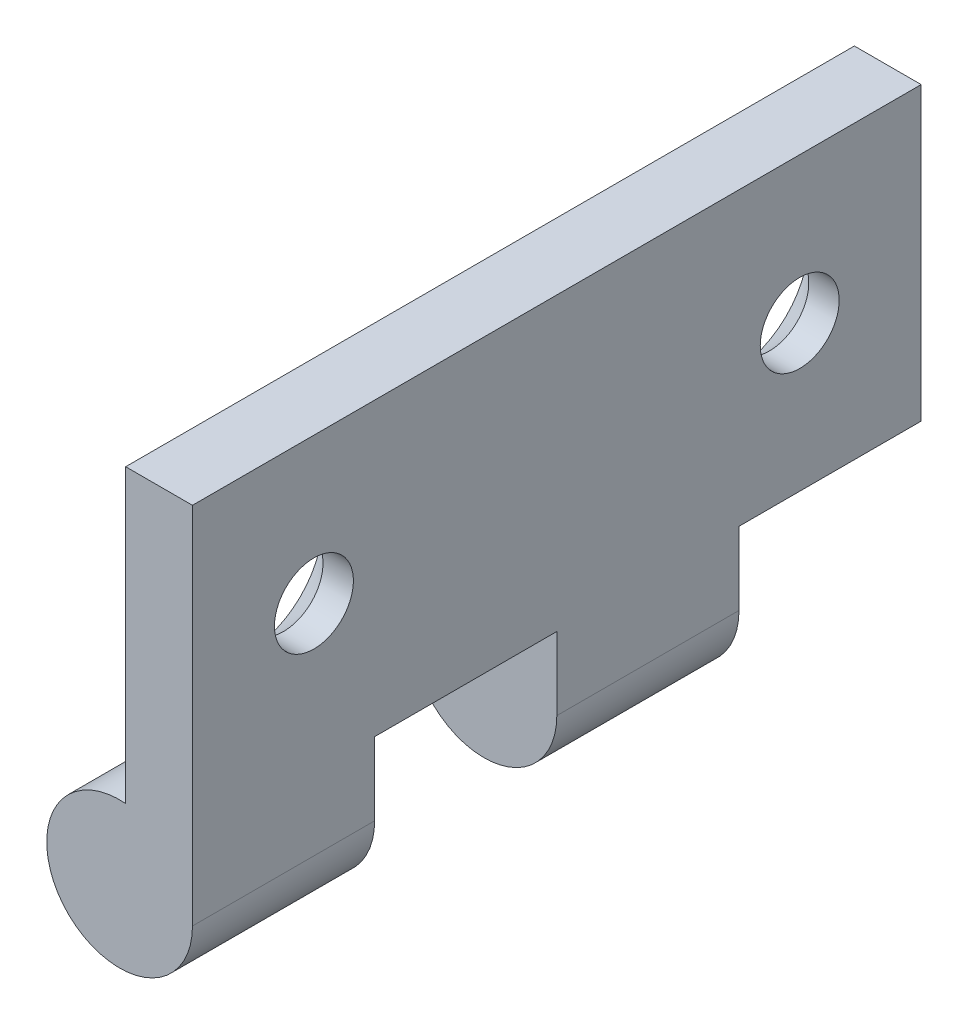
ISO-10303-21;
HEADER;
FILE_DESCRIPTION(('STEP AP214'),'2;1');
FILE_NAME('part.step','',(''),(''),'','','');
FILE_SCHEMA(('AUTOMOTIVE_DESIGN { 1 0 10303 214 1 1 1 1 }'));
ENDSEC;
DATA;
#1=APPLICATION_CONTEXT('core data for automotive mechanical design processes');
#2=APPLICATION_PROTOCOL_DEFINITION('international standard','automotive_design',2000,#1);
#3=PRODUCT_CONTEXT('',#1,'mechanical');
#4=PRODUCT('Part','Part','',(#3));
#5=PRODUCT_RELATED_PRODUCT_CATEGORY('part','',(#4));
#6=PRODUCT_DEFINITION_FORMATION('','',#4);
#7=PRODUCT_DEFINITION_CONTEXT('part definition',#1,'design');
#8=PRODUCT_DEFINITION('design','',#6,#7);
#9=PRODUCT_DEFINITION_SHAPE('','',#8);
#10=(LENGTH_UNIT() NAMED_UNIT(*) SI_UNIT(.MILLI.,.METRE.));
#11=(NAMED_UNIT(*) PLANE_ANGLE_UNIT() SI_UNIT($,.RADIAN.));
#12=(NAMED_UNIT(*) SI_UNIT($,.STERADIAN.) SOLID_ANGLE_UNIT());
#13=UNCERTAINTY_MEASURE_WITH_UNIT(LENGTH_MEASURE(1.E-05),#10,'distance_accuracy_value','');
#14=(GEOMETRIC_REPRESENTATION_CONTEXT(3) GLOBAL_UNCERTAINTY_ASSIGNED_CONTEXT((#13)) GLOBAL_UNIT_ASSIGNED_CONTEXT((#10,
#11,#12)) REPRESENTATION_CONTEXT('',''));
#15=CARTESIAN_POINT('',(0.,0.,0.));
#16=DIRECTION('',(0.,0.,1.));
#17=DIRECTION('',(1.,0.,0.));
#18=AXIS2_PLACEMENT_3D('',#15,#16,#17);
#19=CARTESIAN_POINT('',(-405.506284026579,449.849816187996,266.899348249654));
#20=DIRECTION('',(0.,0.,1.));
#21=DIRECTION('',(0.,-1.,0.));
#22=AXIS2_PLACEMENT_3D('',#19,#20,#21);
#23=CYLINDRICAL_SURFACE('',#22,6.);
#24=CARTESIAN_POINT('',(-405.506284026579,449.849816187996,311.899348249654));
#25=DIRECTION('',(0.,0.,-1.));
#26=DIRECTION('',(0.,-1.,0.));
#27=AXIS2_PLACEMENT_3D('',#24,#25,#26);
#28=CIRCLE('',#27,6.);
#29=CARTESIAN_POINT('',(-405.006284026579,455.828946559547,311.899348249654));
#30=VERTEX_POINT('',#29);
#31=CARTESIAN_POINT('',(-399.506284026579,449.849816187996,311.899348249654));
#32=VERTEX_POINT('',#31);
#33=EDGE_CURVE('E125',#30,#32,#28,.F.);
#34=ORIENTED_EDGE('',*,*,#33,.T.);
#35=DIRECTION('',(0.,0.,1.));
#36=VECTOR('',#35,1.);
#37=CARTESIAN_POINT('',(-399.506284026579,449.849816187996,266.899348249654));
#38=LINE('',#37,#36);
#39=CARTESIAN_POINT('',(-399.506284026579,449.849816187996,326.899348249654));
#40=VERTEX_POINT('',#39);
#41=EDGE_CURVE('E167',#32,#40,#38,.T.);
#42=ORIENTED_EDGE('',*,*,#41,.T.);
#43=CARTESIAN_POINT('',(-405.506284026579,449.849816187996,326.899348249654));
#44=DIRECTION('',(0.,0.,-1.));
#45=DIRECTION('',(0.,-1.,0.));
#46=AXIS2_PLACEMENT_3D('',#43,#44,#45);
#47=CIRCLE('',#46,6.);
#48=CARTESIAN_POINT('',(-405.006284026579,455.828946559547,326.899348249654));
#49=VERTEX_POINT('',#48);
#50=EDGE_CURVE('E155',#40,#49,#47,.T.);
#51=ORIENTED_EDGE('',*,*,#50,.T.);
#52=DIRECTION('',(0.,0.,1.));
#53=VECTOR('',#52,1.);
#54=CARTESIAN_POINT('',(-405.006284026579,455.828946559547,266.899348249654));
#55=LINE('',#54,#53);
#56=EDGE_CURVE('E164',#30,#49,#55,.T.);
#57=ORIENTED_EDGE('',*,*,#56,.F.);
#58=EDGE_LOOP('',(#34,#42,#51,#57));
#59=FACE_BOUND('',#58,.T.);
#60=ADVANCED_FACE('F15',(#59),#23,.T.);
#61=CARTESIAN_POINT('',(-399.506284026579,479.849816187997,266.899348249654));
#62=DIRECTION('',(0.,1.,0.));
#63=DIRECTION('',(0.,0.,1.));
#64=AXIS2_PLACEMENT_3D('',#61,#62,#63);
#65=PLANE('',#64);
#66=DIRECTION('',(1.,0.,0.));
#67=VECTOR('',#66,1.);
#68=CARTESIAN_POINT('',(-399.506284026579,479.849816187997,326.899348249654));
#69=LINE('',#68,#67);
#70=CARTESIAN_POINT('',(-405.006284026579,479.849816187997,326.899348249654));
#71=VERTEX_POINT('',#70);
#72=CARTESIAN_POINT('',(-399.506284026579,479.849816187997,326.899348249654));
#73=VERTEX_POINT('',#72);
#74=EDGE_CURVE('E141',#71,#73,#69,.T.);
#75=ORIENTED_EDGE('',*,*,#74,.T.);
#76=DIRECTION('',(0.,0.,1.));
#77=VECTOR('',#76,1.);
#78=CARTESIAN_POINT('',(-399.506284026579,479.849816187997,266.899348249654));
#79=LINE('',#78,#77);
#80=CARTESIAN_POINT('',(-399.506284026579,479.849816187997,266.899348249654));
#81=VERTEX_POINT('',#80);
#82=EDGE_CURVE('E150',#81,#73,#79,.T.);
#83=ORIENTED_EDGE('',*,*,#82,.F.);
#84=DIRECTION('',(1.,0.,0.));
#85=VECTOR('',#84,1.);
#86=CARTESIAN_POINT('',(-399.506284026579,479.849816187997,266.899348249654));
#87=LINE('',#86,#85);
#88=CARTESIAN_POINT('',(-405.006284026579,479.849816187997,266.899348249654));
#89=VERTEX_POINT('',#88);
#90=EDGE_CURVE('E142',#89,#81,#87,.T.);
#91=ORIENTED_EDGE('',*,*,#90,.F.);
#92=DIRECTION('',(0.,0.,1.));
#93=VECTOR('',#92,1.);
#94=CARTESIAN_POINT('',(-405.006284026579,479.849816187997,266.899348249654));
#95=LINE('',#94,#93);
#96=EDGE_CURVE('E159',#89,#71,#95,.T.);
#97=ORIENTED_EDGE('',*,*,#96,.T.);
#98=EDGE_LOOP('',(#75,#83,#91,#97));
#99=FACE_BOUND('',#98,.T.);
#100=ADVANCED_FACE('F193',(#99),#65,.T.);
#101=CARTESIAN_POINT('',(-405.006284026579,479.849816187997,266.899348249654));
#102=DIRECTION('',(-1.,0.,0.));
#103=DIRECTION('',(0.,0.,1.));
#104=AXIS2_PLACEMENT_3D('',#101,#102,#103);
#105=PLANE('',#104);
#106=CARTESIAN_POINT('',(-405.006284026579,467.849816187996,316.899348249654));
#107=DIRECTION('',(1.,0.,0.));
#108=DIRECTION('',(0.,0.,1.));
#109=AXIS2_PLACEMENT_3D('',#106,#107,#108);
#110=CIRCLE('',#109,6.25000000000003);
#111=CARTESIAN_POINT('',(-405.006284026579,467.849816187996,323.149348249654));
#112=VERTEX_POINT('',#111);
#113=EDGE_CURVE('E23',#112,#112,#110,.F.);
#114=ORIENTED_EDGE('',*,*,#113,.F.);
#115=EDGE_LOOP('',(#114));
#116=FACE_BOUND('',#115,.T.);
#117=CARTESIAN_POINT('',(-405.006284026579,467.849816187996,276.899348249654));
#118=DIRECTION('',(1.,0.,0.));
#119=DIRECTION('',(0.,0.,1.));
#120=AXIS2_PLACEMENT_3D('',#117,#118,#119);
#121=CIRCLE('',#120,6.25000000000003);
#122=CARTESIAN_POINT('',(-405.006284026579,467.849816187996,283.149348249654));
#123=VERTEX_POINT('',#122);
#124=EDGE_CURVE('E181',#123,#123,#121,.F.);
#125=ORIENTED_EDGE('',*,*,#124,.F.);
#126=EDGE_LOOP('',(#125));
#127=FACE_BOUND('',#126,.T.);
#128=DIRECTION('',(0.,0.,1.));
#129=VECTOR('',#128,1.);
#130=CARTESIAN_POINT('',(-405.006284026579,455.849816187996,266.899348249654));
#131=LINE('',#130,#129);
#132=CARTESIAN_POINT('',(-405.006284026579,455.849816187996,266.899348249654));
#133=VERTEX_POINT('',#132);
#134=CARTESIAN_POINT('',(-405.006284026579,455.849816187996,281.899348249654));
#135=VERTEX_POINT('',#134);
#136=EDGE_CURVE('E116',#133,#135,#131,.T.);
#137=ORIENTED_EDGE('',*,*,#136,.T.);
#138=DIRECTION('',(0.,-1.,0.));
#139=VECTOR('',#138,1.);
#140=CARTESIAN_POINT('',(-405.006284026579,479.849816187997,281.899348249654));
#141=LINE('',#140,#139);
#142=CARTESIAN_POINT('',(-405.006284026579,455.828946559547,281.899348249654));
#143=VERTEX_POINT('',#142);
#144=EDGE_CURVE('E99',#135,#143,#141,.T.);
#145=ORIENTED_EDGE('',*,*,#144,.T.);
#146=CARTESIAN_POINT('',(-405.006284026579,455.828946559547,296.899348249654));
#147=VERTEX_POINT('',#146);
#148=EDGE_CURVE('E163',#143,#147,#55,.T.);
#149=ORIENTED_EDGE('',*,*,#148,.T.);
#150=DIRECTION('',(0.,1.,0.));
#151=VECTOR('',#150,1.);
#152=CARTESIAN_POINT('',(-405.006284026579,479.849816187997,296.899348249654));
#153=LINE('',#152,#151);
#154=CARTESIAN_POINT('',(-405.006284026579,455.849816187996,296.899348249654));
#155=VERTEX_POINT('',#154);
#156=EDGE_CURVE('E132',#147,#155,#153,.T.);
#157=ORIENTED_EDGE('',*,*,#156,.T.);
#158=DIRECTION('',(0.,0.,1.));
#159=VECTOR('',#158,1.);
#160=CARTESIAN_POINT('',(-405.006284026579,455.849816187996,266.899348249654));
#161=LINE('',#160,#159);
#162=CARTESIAN_POINT('',(-405.006284026579,455.849816187996,311.899348249654));
#163=VERTEX_POINT('',#162);
#164=EDGE_CURVE('E135',#155,#163,#161,.T.);
#165=ORIENTED_EDGE('',*,*,#164,.T.);
#166=DIRECTION('',(0.,-1.,0.));
#167=VECTOR('',#166,1.);
#168=CARTESIAN_POINT('',(-405.006284026579,479.849816187997,311.899348249654));
#169=LINE('',#168,#167);
#170=EDGE_CURVE('E128',#163,#30,#169,.T.);
#171=ORIENTED_EDGE('',*,*,#170,.T.);
#172=ORIENTED_EDGE('',*,*,#56,.T.);
#173=DIRECTION('',(0.,1.,0.));
#174=VECTOR('',#173,1.);
#175=CARTESIAN_POINT('',(-405.006284026579,479.849816187997,326.899348249654));
#176=LINE('',#175,#174);
#177=EDGE_CURVE('E146',#49,#71,#176,.T.);
#178=ORIENTED_EDGE('',*,*,#177,.T.);
#179=ORIENTED_EDGE('',*,*,#96,.F.);
#180=DIRECTION('',(0.,1.,0.));
#181=VECTOR('',#180,1.);
#182=CARTESIAN_POINT('',(-405.006284026579,479.849816187997,266.899348249654));
#183=LINE('',#182,#181);
#184=EDGE_CURVE('E148',#133,#89,#183,.T.);
#185=ORIENTED_EDGE('',*,*,#184,.F.);
#186=EDGE_LOOP('',(#137,#145,#149,#157,#165,#171,#172,#178,#179,#185));
#187=FACE_BOUND('',#186,.T.);
#188=ADVANCED_FACE('F189',(#116,#127,#187),#105,.T.);
#189=CARTESIAN_POINT('',(-405.506284026579,449.849816187996,281.899348249654));
#190=DIRECTION('',(0.,0.,-1.));
#191=DIRECTION('',(0.,-1.,0.));
#192=AXIS2_PLACEMENT_3D('',#189,#190,#191);
#193=CIRCLE('',#192,6.);
#194=CARTESIAN_POINT('',(-399.506284026579,449.849816187996,281.899348249654));
#195=VERTEX_POINT('',#194);
#196=EDGE_CURVE('E138',#143,#195,#193,.F.);
#197=ORIENTED_EDGE('',*,*,#196,.T.);
#198=CARTESIAN_POINT('',(-399.506284026579,449.849816187996,296.899348249654));
#199=VERTEX_POINT('',#198);
#200=EDGE_CURVE('E107',#195,#199,#38,.T.);
#201=ORIENTED_EDGE('',*,*,#200,.T.);
#202=CARTESIAN_POINT('',(-405.506284026579,449.849816187996,296.899348249654));
#203=DIRECTION('',(0.,0.,1.));
#204=DIRECTION('',(0.,1.,0.));
#205=AXIS2_PLACEMENT_3D('',#202,#203,#204);
#206=CIRCLE('',#205,6.);
#207=EDGE_CURVE('E130',#199,#147,#206,.F.);
#208=ORIENTED_EDGE('',*,*,#207,.T.);
#209=ORIENTED_EDGE('',*,*,#148,.F.);
#210=EDGE_LOOP('',(#197,#201,#208,#209));
#211=FACE_BOUND('',#210,.T.);
#212=ADVANCED_FACE('F192',(#211),#23,.T.);
#213=CARTESIAN_POINT('',(-399.506284026579,479.849816187997,266.899348249654));
#214=DIRECTION('',(1.,0.,0.));
#215=DIRECTION('',(0.,0.,-1.));
#216=AXIS2_PLACEMENT_3D('',#213,#214,#215);
#217=PLANE('',#216);
#218=CARTESIAN_POINT('',(-399.506284026579,467.849816187996,276.899348249654));
#219=DIRECTION('',(-1.,0.,0.));
#220=DIRECTION('',(0.,0.,-1.));
#221=AXIS2_PLACEMENT_3D('',#218,#219,#220);
#222=CIRCLE('',#221,3.25);
#223=CARTESIAN_POINT('',(-399.506284026579,467.849816187996,280.149348249654));
#224=VERTEX_POINT('',#223);
#225=EDGE_CURVE('E121',#224,#224,#222,.T.);
#226=ORIENTED_EDGE('',*,*,#225,.T.);
#227=EDGE_LOOP('',(#226));
#228=FACE_BOUND('',#227,.T.);
#229=CARTESIAN_POINT('',(-399.506284026579,467.849816187996,316.899348249654));
#230=DIRECTION('',(-1.,0.,0.));
#231=DIRECTION('',(0.,0.,-1.));
#232=AXIS2_PLACEMENT_3D('',#229,#230,#231);
#233=CIRCLE('',#232,3.25);
#234=CARTESIAN_POINT('',(-399.506284026579,467.849816187996,320.149348249654));
#235=VERTEX_POINT('',#234);
#236=EDGE_CURVE('E174',#235,#235,#233,.T.);
#237=ORIENTED_EDGE('',*,*,#236,.T.);
#238=EDGE_LOOP('',(#237));
#239=FACE_BOUND('',#238,.T.);
#240=DIRECTION('',(0.,0.,1.));
#241=VECTOR('',#240,1.);
#242=CARTESIAN_POINT('',(-399.506284026579,455.849816187996,266.899348249654));
#243=LINE('',#242,#241);
#244=CARTESIAN_POINT('',(-399.506284026579,455.849816187996,266.899348249654));
#245=VERTEX_POINT('',#244);
#246=CARTESIAN_POINT('',(-399.506284026579,455.849816187996,281.899348249654));
#247=VERTEX_POINT('',#246);
#248=EDGE_CURVE('E105',#245,#247,#243,.T.);
#249=ORIENTED_EDGE('',*,*,#248,.F.);
#250=DIRECTION('',(0.,-1.,0.));
#251=VECTOR('',#250,1.);
#252=CARTESIAN_POINT('',(-399.506284026579,479.849816187997,266.899348249654));
#253=LINE('',#252,#251);
#254=EDGE_CURVE('E145',#81,#245,#253,.T.);
#255=ORIENTED_EDGE('',*,*,#254,.F.);
#256=ORIENTED_EDGE('',*,*,#82,.T.);
#257=DIRECTION('',(0.,-1.,0.));
#258=VECTOR('',#257,1.);
#259=CARTESIAN_POINT('',(-399.506284026579,479.849816187997,326.899348249654));
#260=LINE('',#259,#258);
#261=EDGE_CURVE('E153',#73,#40,#260,.T.);
#262=ORIENTED_EDGE('',*,*,#261,.T.);
#263=ORIENTED_EDGE('',*,*,#41,.F.);
#264=DIRECTION('',(0.,-1.,0.));
#265=VECTOR('',#264,1.);
#266=CARTESIAN_POINT('',(-399.506284026579,455.849816187996,311.899348249654));
#267=LINE('',#266,#265);
#268=CARTESIAN_POINT('',(-399.506284026579,455.849816187996,311.899348249654));
#269=VERTEX_POINT('',#268);
#270=EDGE_CURVE('E30',#269,#32,#267,.T.);
#271=ORIENTED_EDGE('',*,*,#270,.F.);
#272=DIRECTION('',(0.,0.,1.));
#273=VECTOR('',#272,1.);
#274=CARTESIAN_POINT('',(-399.506284026579,455.849816187996,296.899348249654));
#275=LINE('',#274,#273);
#276=CARTESIAN_POINT('',(-399.506284026579,455.849816187996,296.899348249654));
#277=VERTEX_POINT('',#276);
#278=EDGE_CURVE('E118',#277,#269,#275,.T.);
#279=ORIENTED_EDGE('',*,*,#278,.F.);
#280=DIRECTION('',(0.,-1.,0.));
#281=VECTOR('',#280,1.);
#282=CARTESIAN_POINT('',(-399.506284026579,479.849816187997,296.899348249654));
#283=LINE('',#282,#281);
#284=EDGE_CURVE('E162',#277,#199,#283,.T.);
#285=ORIENTED_EDGE('',*,*,#284,.T.);
#286=ORIENTED_EDGE('',*,*,#200,.F.);
#287=DIRECTION('',(0.,-1.,0.));
#288=VECTOR('',#287,1.);
#289=CARTESIAN_POINT('',(-399.506284026579,455.849816187996,281.899348249654));
#290=LINE('',#289,#288);
#291=EDGE_CURVE('E96',#247,#195,#290,.T.);
#292=ORIENTED_EDGE('',*,*,#291,.F.);
#293=EDGE_LOOP('',(#249,#255,#256,#262,#263,#271,#279,#285,#286,#292));
#294=FACE_BOUND('',#293,.T.);
#295=ADVANCED_FACE('F104',(#228,#239,#294),#217,.T.);
#296=CARTESIAN_POINT('',(-405.506284026579,449.849816187996,266.899348249654));
#297=DIRECTION('',(0.,0.,1.));
#298=DIRECTION('',(0.,-1.,0.));
#299=AXIS2_PLACEMENT_3D('',#296,#297,#298);
#300=PLANE('',#299);
#301=ORIENTED_EDGE('',*,*,#184,.T.);
#302=ORIENTED_EDGE('',*,*,#90,.T.);
#303=ORIENTED_EDGE('',*,*,#254,.T.);
#304=DIRECTION('',(-1.,0.,0.));
#305=VECTOR('',#304,1.);
#306=CARTESIAN_POINT('',(-399.506284026579,455.849816187996,266.899348249654));
#307=LINE('',#306,#305);
#308=EDGE_CURVE('E38',#245,#133,#307,.T.);
#309=ORIENTED_EDGE('',*,*,#308,.T.);
#310=EDGE_LOOP('',(#301,#302,#303,#309));
#311=FACE_BOUND('',#310,.T.);
#312=ADVANCED_FACE('F202',(#311),#300,.F.);
#313=CARTESIAN_POINT('',(-405.506284026579,449.849816187996,326.899348249654));
#314=DIRECTION('',(0.,0.,1.));
#315=DIRECTION('',(0.,-1.,0.));
#316=AXIS2_PLACEMENT_3D('',#313,#314,#315);
#317=PLANE('',#316);
#318=ORIENTED_EDGE('',*,*,#74,.F.);
#319=ORIENTED_EDGE('',*,*,#177,.F.);
#320=ORIENTED_EDGE('',*,*,#50,.F.);
#321=ORIENTED_EDGE('',*,*,#261,.F.);
#322=EDGE_LOOP('',(#318,#319,#320,#321));
#323=FACE_BOUND('',#322,.T.);
#324=ADVANCED_FACE('F208',(#323),#317,.T.);
#325=CARTESIAN_POINT('',(-399.506284026579,455.849816187996,266.899348249654));
#326=DIRECTION('',(0.,1.,0.));
#327=DIRECTION('',(0.,0.,1.));
#328=AXIS2_PLACEMENT_3D('',#325,#326,#327);
#329=PLANE('',#328);
#330=ORIENTED_EDGE('',*,*,#136,.F.);
#331=ORIENTED_EDGE('',*,*,#308,.F.);
#332=ORIENTED_EDGE('',*,*,#248,.T.);
#333=DIRECTION('',(-1.,0.,0.));
#334=VECTOR('',#333,1.);
#335=CARTESIAN_POINT('',(-399.506284026579,455.849816187996,281.899348249654));
#336=LINE('',#335,#334);
#337=EDGE_CURVE('E93',#247,#135,#336,.T.);
#338=ORIENTED_EDGE('',*,*,#337,.T.);
#339=EDGE_LOOP('',(#330,#331,#332,#338));
#340=FACE_BOUND('',#339,.T.);
#341=ADVANCED_FACE('F110',(#340),#329,.F.);
#342=CARTESIAN_POINT('',(-399.506284026579,455.849816187996,281.899348249654));
#343=DIRECTION('',(0.,0.,1.));
#344=DIRECTION('',(0.,-1.,0.));
#345=AXIS2_PLACEMENT_3D('',#342,#343,#344);
#346=PLANE('',#345);
#347=ORIENTED_EDGE('',*,*,#144,.F.);
#348=ORIENTED_EDGE('',*,*,#337,.F.);
#349=ORIENTED_EDGE('',*,*,#291,.T.);
#350=ORIENTED_EDGE('',*,*,#196,.F.);
#351=EDGE_LOOP('',(#347,#348,#349,#350));
#352=FACE_BOUND('',#351,.T.);
#353=ADVANCED_FACE('F95',(#352),#346,.F.);
#354=CARTESIAN_POINT('',(-399.506284026579,455.849816187996,296.899348249654));
#355=DIRECTION('',(0.,1.,0.));
#356=DIRECTION('',(0.,0.,1.));
#357=AXIS2_PLACEMENT_3D('',#354,#355,#356);
#358=PLANE('',#357);
#359=ORIENTED_EDGE('',*,*,#164,.F.);
#360=DIRECTION('',(-1.,0.,0.));
#361=VECTOR('',#360,1.);
#362=CARTESIAN_POINT('',(-399.506284026579,455.849816187996,296.899348249654));
#363=LINE('',#362,#361);
#364=EDGE_CURVE('E111',#277,#155,#363,.T.);
#365=ORIENTED_EDGE('',*,*,#364,.F.);
#366=ORIENTED_EDGE('',*,*,#278,.T.);
#367=DIRECTION('',(-1.,0.,0.));
#368=VECTOR('',#367,1.);
#369=CARTESIAN_POINT('',(-399.506284026579,455.849816187996,311.899348249654));
#370=LINE('',#369,#368);
#371=EDGE_CURVE('E113',#269,#163,#370,.T.);
#372=ORIENTED_EDGE('',*,*,#371,.T.);
#373=EDGE_LOOP('',(#359,#365,#366,#372));
#374=FACE_BOUND('',#373,.T.);
#375=ADVANCED_FACE('F216',(#374),#358,.F.);
#376=CARTESIAN_POINT('',(-399.506284026579,455.849816187996,296.899348249654));
#377=DIRECTION('',(0.,0.,-1.));
#378=DIRECTION('',(0.,1.,0.));
#379=AXIS2_PLACEMENT_3D('',#376,#377,#378);
#380=PLANE('',#379);
#381=ORIENTED_EDGE('',*,*,#156,.F.);
#382=ORIENTED_EDGE('',*,*,#207,.F.);
#383=ORIENTED_EDGE('',*,*,#284,.F.);
#384=ORIENTED_EDGE('',*,*,#364,.T.);
#385=EDGE_LOOP('',(#381,#382,#383,#384));
#386=FACE_BOUND('',#385,.T.);
#387=ADVANCED_FACE('F220',(#386),#380,.F.);
#388=CARTESIAN_POINT('',(-399.506284026579,455.849816187996,311.899348249654));
#389=DIRECTION('',(0.,0.,1.));
#390=DIRECTION('',(0.,-1.,0.));
#391=AXIS2_PLACEMENT_3D('',#388,#389,#390);
#392=PLANE('',#391);
#393=ORIENTED_EDGE('',*,*,#170,.F.);
#394=ORIENTED_EDGE('',*,*,#371,.F.);
#395=ORIENTED_EDGE('',*,*,#270,.T.);
#396=ORIENTED_EDGE('',*,*,#33,.F.);
#397=EDGE_LOOP('',(#393,#394,#395,#396));
#398=FACE_BOUND('',#397,.T.);
#399=ADVANCED_FACE('F223',(#398),#392,.F.);
#400=CARTESIAN_POINT('',(-395.006284026579,467.849816187996,316.899348249654));
#401=DIRECTION('',(-1.,0.,0.));
#402=DIRECTION('',(0.,0.,1.));
#403=AXIS2_PLACEMENT_3D('',#400,#401,#402);
#404=CYLINDRICAL_SURFACE('',#403,3.25);
#405=CARTESIAN_POINT('',(-402.006284026579,467.849816187996,316.899348249654));
#406=DIRECTION('',(1.,0.,0.));
#407=DIRECTION('',(0.,0.,1.));
#408=AXIS2_PLACEMENT_3D('',#405,#406,#407);
#409=CIRCLE('',#408,3.25);
#410=CARTESIAN_POINT('',(-402.006284026579,467.849816187996,320.149348249654));
#411=VERTEX_POINT('',#410);
#412=EDGE_CURVE('E173',#411,#411,#409,.T.);
#413=CARTESIAN_POINT('',(-402.006284026579,467.849816187996,320.149348249654));
#414=CARTESIAN_POINT('',(-401.980242359912,467.849816187996,320.149348249654));
#415=CARTESIAN_POINT('',(-401.954200693245,467.849816187996,320.149348249654));
#416=CARTESIAN_POINT('',(-401.902117359912,467.849816187996,320.149348249654));
#417=CARTESIAN_POINT('',(-401.876075693245,467.849816187996,320.149348249654));
#418=CARTESIAN_POINT('',(-401.823992359912,467.849816187996,320.149348249654));
#419=CARTESIAN_POINT('',(-401.797950693245,467.849816187996,320.149348249654));
#420=CARTESIAN_POINT('',(-401.745867359912,467.849816187996,320.149348249654));
#421=CARTESIAN_POINT('',(-401.719825693245,467.849816187996,320.149348249654));
#422=CARTESIAN_POINT('',(-401.667742359912,467.849816187996,320.149348249654));
#423=CARTESIAN_POINT('',(-401.641700693245,467.849816187996,320.149348249654));
#424=CARTESIAN_POINT('',(-401.589617359912,467.849816187996,320.149348249654));
#425=CARTESIAN_POINT('',(-401.563575693245,467.849816187996,320.149348249654));
#426=CARTESIAN_POINT('',(-401.511492359912,467.849816187996,320.149348249654));
#427=CARTESIAN_POINT('',(-401.485450693245,467.849816187996,320.149348249654));
#428=CARTESIAN_POINT('',(-401.433367359912,467.849816187996,320.149348249654));
#429=CARTESIAN_POINT('',(-401.407325693245,467.849816187996,320.149348249654));
#430=CARTESIAN_POINT('',(-401.355242359912,467.849816187996,320.149348249654));
#431=CARTESIAN_POINT('',(-401.329200693245,467.849816187996,320.149348249654));
#432=CARTESIAN_POINT('',(-401.277117359912,467.849816187996,320.149348249654));
#433=CARTESIAN_POINT('',(-401.251075693245,467.849816187996,320.149348249654));
#434=CARTESIAN_POINT('',(-401.198992359912,467.849816187996,320.149348249654));
#435=CARTESIAN_POINT('',(-401.172950693245,467.849816187996,320.149348249654));
#436=CARTESIAN_POINT('',(-401.120867359912,467.849816187996,320.149348249654));
#437=CARTESIAN_POINT('',(-401.094825693245,467.849816187996,320.149348249654));
#438=CARTESIAN_POINT('',(-401.042742359912,467.849816187996,320.149348249654));
#439=CARTESIAN_POINT('',(-401.016700693245,467.849816187996,320.149348249654));
#440=CARTESIAN_POINT('',(-400.964617359912,467.849816187996,320.149348249654));
#441=CARTESIAN_POINT('',(-400.938575693245,467.849816187996,320.149348249654));
#442=CARTESIAN_POINT('',(-400.886492359912,467.849816187996,320.149348249654));
#443=CARTESIAN_POINT('',(-400.860450693245,467.849816187996,320.149348249654));
#444=CARTESIAN_POINT('',(-400.808367359912,467.849816187996,320.149348249654));
#445=CARTESIAN_POINT('',(-400.782325693245,467.849816187996,320.149348249654));
#446=CARTESIAN_POINT('',(-400.730242359912,467.849816187996,320.149348249654));
#447=CARTESIAN_POINT('',(-400.704200693245,467.849816187996,320.149348249654));
#448=CARTESIAN_POINT('',(-400.652117359912,467.849816187996,320.149348249654));
#449=CARTESIAN_POINT('',(-400.626075693245,467.849816187996,320.149348249654));
#450=CARTESIAN_POINT('',(-400.573992359912,467.849816187996,320.149348249654));
#451=CARTESIAN_POINT('',(-400.547950693245,467.849816187996,320.149348249654));
#452=CARTESIAN_POINT('',(-400.495867359912,467.849816187996,320.149348249654));
#453=CARTESIAN_POINT('',(-400.469825693245,467.849816187996,320.149348249654));
#454=CARTESIAN_POINT('',(-400.417742359912,467.849816187996,320.149348249654));
#455=CARTESIAN_POINT('',(-400.391700693245,467.849816187996,320.149348249654));
#456=CARTESIAN_POINT('',(-400.339617359912,467.849816187996,320.149348249654));
#457=CARTESIAN_POINT('',(-400.313575693245,467.849816187996,320.149348249654));
#458=CARTESIAN_POINT('',(-400.261492359912,467.849816187996,320.149348249654));
#459=CARTESIAN_POINT('',(-400.235450693245,467.849816187996,320.149348249654));
#460=CARTESIAN_POINT('',(-400.183367359912,467.849816187996,320.149348249654));
#461=CARTESIAN_POINT('',(-400.157325693245,467.849816187996,320.149348249654));
#462=CARTESIAN_POINT('',(-400.105242359912,467.849816187996,320.149348249654));
#463=CARTESIAN_POINT('',(-400.079200693245,467.849816187996,320.149348249654));
#464=CARTESIAN_POINT('',(-400.027117359912,467.849816187996,320.149348249654));
#465=CARTESIAN_POINT('',(-400.001075693245,467.849816187996,320.149348249654));
#466=CARTESIAN_POINT('',(-399.948992359912,467.849816187996,320.149348249654));
#467=CARTESIAN_POINT('',(-399.922950693245,467.849816187996,320.149348249654));
#468=CARTESIAN_POINT('',(-399.870867359912,467.849816187996,320.149348249654));
#469=CARTESIAN_POINT('',(-399.844825693245,467.849816187996,320.149348249654));
#470=CARTESIAN_POINT('',(-399.792742359912,467.849816187996,320.149348249654));
#471=CARTESIAN_POINT('',(-399.766700693245,467.849816187996,320.149348249654));
#472=CARTESIAN_POINT('',(-399.714617359912,467.849816187996,320.149348249654));
#473=CARTESIAN_POINT('',(-399.688575693245,467.849816187996,320.149348249654));
#474=CARTESIAN_POINT('',(-399.636492359912,467.849816187996,320.149348249654));
#475=CARTESIAN_POINT('',(-399.610450693245,467.849816187996,320.149348249654));
#476=CARTESIAN_POINT('',(-399.558367359912,467.849816187996,320.149348249654));
#477=CARTESIAN_POINT('',(-399.532325693245,467.849816187996,320.149348249654));
#478=CARTESIAN_POINT('',(-399.506284026579,467.849816187996,320.149348249654));
#479=B_SPLINE_CURVE_WITH_KNOTS('',3,(#413,#414,#415,#416,#417,#418,#419,#420,#421,#422,#423,
#424,#425,#426,#427,#428,#429,#430,#431,#432,#433,#434,#435,#436,#437,#438,#439,#440,#441,#442,
#443,#444,#445,#446,#447,#448,#449,#450,#451,#452,#453,#454,#455,#456,#457,#458,#459,#460,#461,
#462,#463,#464,#465,#466,#467,#468,#469,#470,#471,#472,#473,#474,#475,#476,#477,#478),
.UNSPECIFIED.,.F.,.F.,(4,2,2,2,2,2,2,2,2,2,2,2,2,2,2,2,2,2,2,2,2,2,2,2,2,2,2,2,2,2,2,2,4),(0.,
0.0781249999999845,0.156249999999969,0.234374999999953,0.312499999999993,0.390624999999978,
0.468749999999962,0.546874999999947,0.624999999999987,0.703124999999971,0.781249999999956,
0.85937499999994,0.93749999999998,1.01562499999996,1.09374999999995,1.17187499999993,
1.24999999999997,1.32812499999996,1.40624999999994,1.48437499999993,1.56249999999997,
1.64062499999995,1.71874999999994,1.79687499999992,1.87499999999996,1.95312499999994,
2.03124999999993,2.10937499999991,2.18749999999995,2.26562499999994,2.34374999999992,
2.42187499999991,2.49999999999995),.UNSPECIFIED.);
#480=EDGE_CURVE('BSEAM225',#411,#235,#479,.T.);
#481=ORIENTED_EDGE('',*,*,#412,.F.);
#482=ORIENTED_EDGE('',*,*,#236,.F.);
#483=ORIENTED_EDGE('',*,*,#480,.T.);
#484=ORIENTED_EDGE('',*,*,#480,.F.);
#485=EDGE_LOOP('',(#481,#483,#482,#484));
#486=FACE_BOUND('',#485,.T.);
#487=ADVANCED_FACE('F225',(#486),#404,.F.);
#488=CARTESIAN_POINT('',(-395.006284026579,467.849816187996,276.899348249654));
#489=DIRECTION('',(-1.,0.,0.));
#490=DIRECTION('',(0.,0.,1.));
#491=AXIS2_PLACEMENT_3D('',#488,#489,#490);
#492=CYLINDRICAL_SURFACE('',#491,3.25);
#493=CARTESIAN_POINT('',(-402.006284026579,467.849816187996,276.899348249654));
#494=DIRECTION('',(1.,0.,0.));
#495=DIRECTION('',(0.,0.,1.));
#496=AXIS2_PLACEMENT_3D('',#493,#494,#495);
#497=CIRCLE('',#496,3.25);
#498=CARTESIAN_POINT('',(-402.006284026579,467.849816187996,280.149348249654));
#499=VERTEX_POINT('',#498);
#500=EDGE_CURVE('E10',#499,#499,#497,.T.);
#501=CARTESIAN_POINT('',(-402.006284026579,467.849816187996,280.149348249654));
#502=CARTESIAN_POINT('',(-401.980242359912,467.849816187996,280.149348249654));
#503=CARTESIAN_POINT('',(-401.954200693245,467.849816187996,280.149348249654));
#504=CARTESIAN_POINT('',(-401.902117359912,467.849816187996,280.149348249654));
#505=CARTESIAN_POINT('',(-401.876075693245,467.849816187996,280.149348249654));
#506=CARTESIAN_POINT('',(-401.823992359912,467.849816187996,280.149348249654));
#507=CARTESIAN_POINT('',(-401.797950693245,467.849816187996,280.149348249654));
#508=CARTESIAN_POINT('',(-401.745867359912,467.849816187996,280.149348249654));
#509=CARTESIAN_POINT('',(-401.719825693245,467.849816187996,280.149348249654));
#510=CARTESIAN_POINT('',(-401.667742359912,467.849816187996,280.149348249654));
#511=CARTESIAN_POINT('',(-401.641700693245,467.849816187996,280.149348249654));
#512=CARTESIAN_POINT('',(-401.589617359912,467.849816187996,280.149348249654));
#513=CARTESIAN_POINT('',(-401.563575693245,467.849816187996,280.149348249654));
#514=CARTESIAN_POINT('',(-401.511492359912,467.849816187996,280.149348249654));
#515=CARTESIAN_POINT('',(-401.485450693245,467.849816187996,280.149348249654));
#516=CARTESIAN_POINT('',(-401.433367359912,467.849816187996,280.149348249654));
#517=CARTESIAN_POINT('',(-401.407325693245,467.849816187996,280.149348249654));
#518=CARTESIAN_POINT('',(-401.355242359912,467.849816187996,280.149348249654));
#519=CARTESIAN_POINT('',(-401.329200693245,467.849816187996,280.149348249654));
#520=CARTESIAN_POINT('',(-401.277117359912,467.849816187996,280.149348249654));
#521=CARTESIAN_POINT('',(-401.251075693245,467.849816187996,280.149348249654));
#522=CARTESIAN_POINT('',(-401.198992359912,467.849816187996,280.149348249654));
#523=CARTESIAN_POINT('',(-401.172950693245,467.849816187996,280.149348249654));
#524=CARTESIAN_POINT('',(-401.120867359912,467.849816187996,280.149348249654));
#525=CARTESIAN_POINT('',(-401.094825693245,467.849816187996,280.149348249654));
#526=CARTESIAN_POINT('',(-401.042742359912,467.849816187996,280.149348249654));
#527=CARTESIAN_POINT('',(-401.016700693245,467.849816187996,280.149348249654));
#528=CARTESIAN_POINT('',(-400.964617359912,467.849816187996,280.149348249654));
#529=CARTESIAN_POINT('',(-400.938575693245,467.849816187996,280.149348249654));
#530=CARTESIAN_POINT('',(-400.886492359912,467.849816187996,280.149348249654));
#531=CARTESIAN_POINT('',(-400.860450693245,467.849816187996,280.149348249654));
#532=CARTESIAN_POINT('',(-400.808367359912,467.849816187996,280.149348249654));
#533=CARTESIAN_POINT('',(-400.782325693245,467.849816187996,280.149348249654));
#534=CARTESIAN_POINT('',(-400.730242359912,467.849816187996,280.149348249654));
#535=CARTESIAN_POINT('',(-400.704200693245,467.849816187996,280.149348249654));
#536=CARTESIAN_POINT('',(-400.652117359912,467.849816187996,280.149348249654));
#537=CARTESIAN_POINT('',(-400.626075693245,467.849816187996,280.149348249654));
#538=CARTESIAN_POINT('',(-400.573992359912,467.849816187996,280.149348249654));
#539=CARTESIAN_POINT('',(-400.547950693245,467.849816187996,280.149348249654));
#540=CARTESIAN_POINT('',(-400.495867359912,467.849816187996,280.149348249654));
#541=CARTESIAN_POINT('',(-400.469825693245,467.849816187996,280.149348249654));
#542=CARTESIAN_POINT('',(-400.417742359912,467.849816187996,280.149348249654));
#543=CARTESIAN_POINT('',(-400.391700693245,467.849816187996,280.149348249654));
#544=CARTESIAN_POINT('',(-400.339617359912,467.849816187996,280.149348249654));
#545=CARTESIAN_POINT('',(-400.313575693245,467.849816187996,280.149348249654));
#546=CARTESIAN_POINT('',(-400.261492359912,467.849816187996,280.149348249654));
#547=CARTESIAN_POINT('',(-400.235450693245,467.849816187996,280.149348249654));
#548=CARTESIAN_POINT('',(-400.183367359912,467.849816187996,280.149348249654));
#549=CARTESIAN_POINT('',(-400.157325693245,467.849816187996,280.149348249654));
#550=CARTESIAN_POINT('',(-400.105242359912,467.849816187996,280.149348249654));
#551=CARTESIAN_POINT('',(-400.079200693245,467.849816187996,280.149348249654));
#552=CARTESIAN_POINT('',(-400.027117359912,467.849816187996,280.149348249654));
#553=CARTESIAN_POINT('',(-400.001075693245,467.849816187996,280.149348249654));
#554=CARTESIAN_POINT('',(-399.948992359912,467.849816187996,280.149348249654));
#555=CARTESIAN_POINT('',(-399.922950693245,467.849816187996,280.149348249654));
#556=CARTESIAN_POINT('',(-399.870867359912,467.849816187996,280.149348249654));
#557=CARTESIAN_POINT('',(-399.844825693245,467.849816187996,280.149348249654));
#558=CARTESIAN_POINT('',(-399.792742359912,467.849816187996,280.149348249654));
#559=CARTESIAN_POINT('',(-399.766700693245,467.849816187996,280.149348249654));
#560=CARTESIAN_POINT('',(-399.714617359912,467.849816187996,280.149348249654));
#561=CARTESIAN_POINT('',(-399.688575693245,467.849816187996,280.149348249654));
#562=CARTESIAN_POINT('',(-399.636492359912,467.849816187996,280.149348249654));
#563=CARTESIAN_POINT('',(-399.610450693245,467.849816187996,280.149348249654));
#564=CARTESIAN_POINT('',(-399.558367359912,467.849816187996,280.149348249654));
#565=CARTESIAN_POINT('',(-399.532325693245,467.849816187996,280.149348249654));
#566=CARTESIAN_POINT('',(-399.506284026579,467.849816187996,280.149348249654));
#567=B_SPLINE_CURVE_WITH_KNOTS('',3,(#501,#502,#503,#504,#505,#506,#507,#508,#509,#510,#511,
#512,#513,#514,#515,#516,#517,#518,#519,#520,#521,#522,#523,#524,#525,#526,#527,#528,#529,#530,
#531,#532,#533,#534,#535,#536,#537,#538,#539,#540,#541,#542,#543,#544,#545,#546,#547,#548,#549,
#550,#551,#552,#553,#554,#555,#556,#557,#558,#559,#560,#561,#562,#563,#564,#565,#566),
.UNSPECIFIED.,.F.,.F.,(4,2,2,2,2,2,2,2,2,2,2,2,2,2,2,2,2,2,2,2,2,2,2,2,2,2,2,2,2,2,2,2,4),(0.,
0.0781249999999845,0.156249999999969,0.234374999999953,0.312499999999993,0.390624999999978,
0.468749999999962,0.546874999999947,0.624999999999987,0.703124999999971,0.781249999999956,
0.85937499999994,0.93749999999998,1.01562499999996,1.09374999999995,1.17187499999993,
1.24999999999997,1.32812499999996,1.40624999999994,1.48437499999993,1.56249999999997,
1.64062499999995,1.71874999999994,1.79687499999992,1.87499999999996,1.95312499999994,
2.03124999999993,2.10937499999991,2.18749999999995,2.26562499999994,2.34374999999992,
2.42187499999991,2.49999999999995),.UNSPECIFIED.);
#568=EDGE_CURVE('BSEAM232',#499,#224,#567,.T.);
#569=ORIENTED_EDGE('',*,*,#500,.F.);
#570=ORIENTED_EDGE('',*,*,#225,.F.);
#571=ORIENTED_EDGE('',*,*,#568,.T.);
#572=ORIENTED_EDGE('',*,*,#568,.F.);
#573=EDGE_LOOP('',(#569,#571,#570,#572));
#574=FACE_BOUND('',#573,.T.);
#575=ADVANCED_FACE('F232',(#574),#492,.F.);
#576=CARTESIAN_POINT('',(-402.006284026579,467.849816187996,316.899348249654));
#577=DIRECTION('',(-1.,0.,0.));
#578=DIRECTION('',(0.,0.,1.));
#579=AXIS2_PLACEMENT_3D('',#576,#577,#578);
#580=CONICAL_SURFACE('',#579,3.25,0.78539816339745);
#581=CARTESIAN_POINT('',(-405.006284026579,467.849816187996,323.149348249654));
#582=CARTESIAN_POINT('',(-404.975034026579,467.849816187996,323.118098249654));
#583=CARTESIAN_POINT('',(-404.943784026579,467.849816187996,323.086848249654));
#584=CARTESIAN_POINT('',(-404.881284026579,467.849816187996,323.024348249654));
#585=CARTESIAN_POINT('',(-404.850034026579,467.849816187996,322.993098249654));
#586=CARTESIAN_POINT('',(-404.787534026579,467.849816187996,322.930598249654));
#587=CARTESIAN_POINT('',(-404.756284026579,467.849816187996,322.899348249654));
#588=CARTESIAN_POINT('',(-404.693784026579,467.849816187996,322.836848249654));
#589=CARTESIAN_POINT('',(-404.662534026579,467.849816187996,322.805598249654));
#590=CARTESIAN_POINT('',(-404.600034026579,467.849816187996,322.743098249654));
#591=CARTESIAN_POINT('',(-404.568784026579,467.849816187996,322.711848249654));
#592=CARTESIAN_POINT('',(-404.506284026579,467.849816187996,322.649348249654));
#593=CARTESIAN_POINT('',(-404.475034026579,467.849816187996,322.618098249654));
#594=CARTESIAN_POINT('',(-404.412534026579,467.849816187996,322.555598249654));
#595=CARTESIAN_POINT('',(-404.381284026579,467.849816187996,322.524348249654));
#596=CARTESIAN_POINT('',(-404.318784026579,467.849816187996,322.461848249654));
#597=CARTESIAN_POINT('',(-404.287534026579,467.849816187996,322.430598249654));
#598=CARTESIAN_POINT('',(-404.225034026579,467.849816187996,322.368098249654));
#599=CARTESIAN_POINT('',(-404.193784026579,467.849816187996,322.336848249654));
#600=CARTESIAN_POINT('',(-404.131284026579,467.849816187996,322.274348249654));
#601=CARTESIAN_POINT('',(-404.100034026579,467.849816187996,322.243098249654));
#602=CARTESIAN_POINT('',(-404.037534026579,467.849816187996,322.180598249654));
#603=CARTESIAN_POINT('',(-404.006284026579,467.849816187996,322.149348249654));
#604=CARTESIAN_POINT('',(-403.943784026579,467.849816187996,322.086848249654));
#605=CARTESIAN_POINT('',(-403.912534026579,467.849816187996,322.055598249654));
#606=CARTESIAN_POINT('',(-403.850034026579,467.849816187996,321.993098249654));
#607=CARTESIAN_POINT('',(-403.818784026579,467.849816187996,321.961848249654));
#608=CARTESIAN_POINT('',(-403.756284026579,467.849816187996,321.899348249654));
#609=CARTESIAN_POINT('',(-403.725034026579,467.849816187996,321.868098249654));
#610=CARTESIAN_POINT('',(-403.662534026579,467.849816187996,321.805598249654));
#611=CARTESIAN_POINT('',(-403.631284026579,467.849816187996,321.774348249654));
#612=CARTESIAN_POINT('',(-403.568784026579,467.849816187996,321.711848249654));
#613=CARTESIAN_POINT('',(-403.537534026579,467.849816187996,321.680598249654));
#614=CARTESIAN_POINT('',(-403.475034026579,467.849816187996,321.618098249654));
#615=CARTESIAN_POINT('',(-403.443784026579,467.849816187996,321.586848249654));
#616=CARTESIAN_POINT('',(-403.381284026579,467.849816187996,321.524348249654));
#617=CARTESIAN_POINT('',(-403.350034026579,467.849816187996,321.493098249654));
#618=CARTESIAN_POINT('',(-403.287534026579,467.849816187996,321.430598249654));
#619=CARTESIAN_POINT('',(-403.256284026579,467.849816187996,321.399348249654));
#620=CARTESIAN_POINT('',(-403.193784026579,467.849816187996,321.336848249654));
#621=CARTESIAN_POINT('',(-403.162534026579,467.849816187996,321.305598249654));
#622=CARTESIAN_POINT('',(-403.100034026579,467.849816187996,321.243098249654));
#623=CARTESIAN_POINT('',(-403.068784026579,467.849816187996,321.211848249654));
#624=CARTESIAN_POINT('',(-403.006284026579,467.849816187996,321.149348249654));
#625=CARTESIAN_POINT('',(-402.975034026579,467.849816187996,321.118098249654));
#626=CARTESIAN_POINT('',(-402.912534026579,467.849816187996,321.055598249654));
#627=CARTESIAN_POINT('',(-402.881284026579,467.849816187996,321.024348249654));
#628=CARTESIAN_POINT('',(-402.818784026579,467.849816187996,320.961848249654));
#629=CARTESIAN_POINT('',(-402.787534026579,467.849816187996,320.930598249654));
#630=CARTESIAN_POINT('',(-402.725034026579,467.849816187996,320.868098249654));
#631=CARTESIAN_POINT('',(-402.693784026579,467.849816187996,320.836848249654));
#632=CARTESIAN_POINT('',(-402.631284026579,467.849816187996,320.774348249654));
#633=CARTESIAN_POINT('',(-402.600034026579,467.849816187996,320.743098249654));
#634=CARTESIAN_POINT('',(-402.537534026579,467.849816187996,320.680598249654));
#635=CARTESIAN_POINT('',(-402.506284026579,467.849816187996,320.649348249654));
#636=CARTESIAN_POINT('',(-402.443784026579,467.849816187996,320.586848249654));
#637=CARTESIAN_POINT('',(-402.412534026579,467.849816187996,320.555598249654));
#638=CARTESIAN_POINT('',(-402.350034026579,467.849816187996,320.493098249654));
#639=CARTESIAN_POINT('',(-402.318784026579,467.849816187996,320.461848249654));
#640=CARTESIAN_POINT('',(-402.256284026579,467.849816187996,320.399348249654));
#641=CARTESIAN_POINT('',(-402.225034026579,467.849816187996,320.368098249654));
#642=CARTESIAN_POINT('',(-402.162534026579,467.849816187996,320.305598249654));
#643=CARTESIAN_POINT('',(-402.131284026579,467.849816187996,320.274348249654));
#644=CARTESIAN_POINT('',(-402.068784026579,467.849816187996,320.211848249654));
#645=CARTESIAN_POINT('',(-402.037534026579,467.849816187996,320.180598249654));
#646=CARTESIAN_POINT('',(-402.006284026579,467.849816187996,320.149348249654));
#647=B_SPLINE_CURVE_WITH_KNOTS('',3,(#581,#582,#583,#584,#585,#586,#587,#588,#589,#590,#591,
#592,#593,#594,#595,#596,#597,#598,#599,#600,#601,#602,#603,#604,#605,#606,#607,#608,#609,#610,
#611,#612,#613,#614,#615,#616,#617,#618,#619,#620,#621,#622,#623,#624,#625,#626,#627,#628,#629,
#630,#631,#632,#633,#634,#635,#636,#637,#638,#639,#640,#641,#642,#643,#644,#645,#646),
.UNSPECIFIED.,.F.,.F.,(4,2,2,2,2,2,2,2,2,2,2,2,2,2,2,2,2,2,2,2,2,2,2,2,2,2,2,2,2,2,2,2,4),(0.,
0.132582521472483,0.265165042944965,0.397747564417448,0.530330085889931,0.662912607362414,
0.795495128834896,0.928077650307379,1.06066017177986,1.19324269325234,1.32582521472483,
1.45840773619731,1.59099025766979,1.72357277914227,1.85615530061476,1.98873782208724,
2.12132034355972,2.25390286503221,2.38648538650469,2.51906790797717,2.65165042944965,
2.78423295092214,2.91681547239462,3.0493979938671,3.18198051533962,3.31456303681211,
3.44714555828459,3.57972807975707,3.71231060122956,3.84489312270204,3.97747564417452,
4.110058165647,4.24264068711945),.UNSPECIFIED.);
#648=EDGE_CURVE('BSEAM186',#112,#411,#647,.T.);
#649=ORIENTED_EDGE('',*,*,#113,.T.);
#650=ORIENTED_EDGE('',*,*,#412,.T.);
#651=ORIENTED_EDGE('',*,*,#648,.T.);
#652=ORIENTED_EDGE('',*,*,#648,.F.);
#653=EDGE_LOOP('',(#649,#651,#650,#652));
#654=FACE_BOUND('',#653,.T.);
#655=ADVANCED_FACE('F186',(#654),#580,.F.);
#656=CARTESIAN_POINT('',(-402.006284026579,467.849816187996,276.899348249654));
#657=DIRECTION('',(-1.,0.,0.));
#658=DIRECTION('',(0.,0.,1.));
#659=AXIS2_PLACEMENT_3D('',#656,#657,#658);
#660=CONICAL_SURFACE('',#659,3.25,0.78539816339745);
#661=CARTESIAN_POINT('',(-405.006284026579,467.849816187996,283.149348249654));
#662=CARTESIAN_POINT('',(-404.975034026579,467.849816187996,283.118098249654));
#663=CARTESIAN_POINT('',(-404.943784026579,467.849816187996,283.086848249654));
#664=CARTESIAN_POINT('',(-404.881284026579,467.849816187996,283.024348249654));
#665=CARTESIAN_POINT('',(-404.850034026579,467.849816187996,282.993098249654));
#666=CARTESIAN_POINT('',(-404.787534026579,467.849816187996,282.930598249654));
#667=CARTESIAN_POINT('',(-404.756284026579,467.849816187996,282.899348249654));
#668=CARTESIAN_POINT('',(-404.693784026579,467.849816187996,282.836848249654));
#669=CARTESIAN_POINT('',(-404.662534026579,467.849816187996,282.805598249654));
#670=CARTESIAN_POINT('',(-404.600034026579,467.849816187996,282.743098249654));
#671=CARTESIAN_POINT('',(-404.568784026579,467.849816187996,282.711848249654));
#672=CARTESIAN_POINT('',(-404.506284026579,467.849816187996,282.649348249654));
#673=CARTESIAN_POINT('',(-404.475034026579,467.849816187996,282.618098249654));
#674=CARTESIAN_POINT('',(-404.412534026579,467.849816187996,282.555598249654));
#675=CARTESIAN_POINT('',(-404.381284026579,467.849816187996,282.524348249654));
#676=CARTESIAN_POINT('',(-404.318784026579,467.849816187996,282.461848249654));
#677=CARTESIAN_POINT('',(-404.287534026579,467.849816187996,282.430598249654));
#678=CARTESIAN_POINT('',(-404.225034026579,467.849816187996,282.368098249654));
#679=CARTESIAN_POINT('',(-404.193784026579,467.849816187996,282.336848249654));
#680=CARTESIAN_POINT('',(-404.131284026579,467.849816187996,282.274348249654));
#681=CARTESIAN_POINT('',(-404.100034026579,467.849816187996,282.243098249654));
#682=CARTESIAN_POINT('',(-404.037534026579,467.849816187996,282.180598249654));
#683=CARTESIAN_POINT('',(-404.006284026579,467.849816187996,282.149348249654));
#684=CARTESIAN_POINT('',(-403.943784026579,467.849816187996,282.086848249654));
#685=CARTESIAN_POINT('',(-403.912534026579,467.849816187996,282.055598249654));
#686=CARTESIAN_POINT('',(-403.850034026579,467.849816187996,281.993098249654));
#687=CARTESIAN_POINT('',(-403.818784026579,467.849816187996,281.961848249654));
#688=CARTESIAN_POINT('',(-403.756284026579,467.849816187996,281.899348249654));
#689=CARTESIAN_POINT('',(-403.725034026579,467.849816187996,281.868098249654));
#690=CARTESIAN_POINT('',(-403.662534026579,467.849816187996,281.805598249654));
#691=CARTESIAN_POINT('',(-403.631284026579,467.849816187996,281.774348249654));
#692=CARTESIAN_POINT('',(-403.568784026579,467.849816187996,281.711848249654));
#693=CARTESIAN_POINT('',(-403.537534026579,467.849816187996,281.680598249654));
#694=CARTESIAN_POINT('',(-403.475034026579,467.849816187996,281.618098249654));
#695=CARTESIAN_POINT('',(-403.443784026579,467.849816187996,281.586848249654));
#696=CARTESIAN_POINT('',(-403.381284026579,467.849816187996,281.524348249654));
#697=CARTESIAN_POINT('',(-403.350034026579,467.849816187996,281.493098249654));
#698=CARTESIAN_POINT('',(-403.287534026579,467.849816187996,281.430598249654));
#699=CARTESIAN_POINT('',(-403.256284026579,467.849816187996,281.399348249654));
#700=CARTESIAN_POINT('',(-403.193784026579,467.849816187996,281.336848249654));
#701=CARTESIAN_POINT('',(-403.162534026579,467.849816187996,281.305598249654));
#702=CARTESIAN_POINT('',(-403.100034026579,467.849816187996,281.243098249654));
#703=CARTESIAN_POINT('',(-403.068784026579,467.849816187996,281.211848249654));
#704=CARTESIAN_POINT('',(-403.006284026579,467.849816187996,281.149348249654));
#705=CARTESIAN_POINT('',(-402.975034026579,467.849816187996,281.118098249654));
#706=CARTESIAN_POINT('',(-402.912534026579,467.849816187996,281.055598249654));
#707=CARTESIAN_POINT('',(-402.881284026579,467.849816187996,281.024348249654));
#708=CARTESIAN_POINT('',(-402.818784026579,467.849816187996,280.961848249654));
#709=CARTESIAN_POINT('',(-402.787534026579,467.849816187996,280.930598249654));
#710=CARTESIAN_POINT('',(-402.725034026579,467.849816187996,280.868098249654));
#711=CARTESIAN_POINT('',(-402.693784026579,467.849816187996,280.836848249654));
#712=CARTESIAN_POINT('',(-402.631284026579,467.849816187996,280.774348249654));
#713=CARTESIAN_POINT('',(-402.600034026579,467.849816187996,280.743098249654));
#714=CARTESIAN_POINT('',(-402.537534026579,467.849816187996,280.680598249654));
#715=CARTESIAN_POINT('',(-402.506284026579,467.849816187996,280.649348249654));
#716=CARTESIAN_POINT('',(-402.443784026579,467.849816187996,280.586848249654));
#717=CARTESIAN_POINT('',(-402.412534026579,467.849816187996,280.555598249654));
#718=CARTESIAN_POINT('',(-402.350034026579,467.849816187996,280.493098249654));
#719=CARTESIAN_POINT('',(-402.318784026579,467.849816187996,280.461848249654));
#720=CARTESIAN_POINT('',(-402.256284026579,467.849816187996,280.399348249654));
#721=CARTESIAN_POINT('',(-402.225034026579,467.849816187996,280.368098249654));
#722=CARTESIAN_POINT('',(-402.162534026579,467.849816187996,280.305598249654));
#723=CARTESIAN_POINT('',(-402.131284026579,467.849816187996,280.274348249654));
#724=CARTESIAN_POINT('',(-402.068784026579,467.849816187996,280.211848249654));
#725=CARTESIAN_POINT('',(-402.037534026579,467.849816187996,280.180598249654));
#726=CARTESIAN_POINT('',(-402.006284026579,467.849816187996,280.149348249654));
#727=B_SPLINE_CURVE_WITH_KNOTS('',3,(#661,#662,#663,#664,#665,#666,#667,#668,#669,#670,#671,
#672,#673,#674,#675,#676,#677,#678,#679,#680,#681,#682,#683,#684,#685,#686,#687,#688,#689,#690,
#691,#692,#693,#694,#695,#696,#697,#698,#699,#700,#701,#702,#703,#704,#705,#706,#707,#708,#709,
#710,#711,#712,#713,#714,#715,#716,#717,#718,#719,#720,#721,#722,#723,#724,#725,#726),
.UNSPECIFIED.,.F.,.F.,(4,2,2,2,2,2,2,2,2,2,2,2,2,2,2,2,2,2,2,2,2,2,2,2,2,2,2,2,2,2,2,2,4),(0.,
0.132582521472483,0.265165042944965,0.397747564417448,0.530330085889931,0.662912607362414,
0.795495128834896,0.928077650307379,1.06066017177986,1.19324269325234,1.32582521472483,
1.45840773619731,1.59099025766979,1.72357277914227,1.85615530061476,1.98873782208724,
2.12132034355972,2.25390286503221,2.38648538650469,2.51906790797717,2.65165042944965,
2.78423295092214,2.91681547239462,3.0493979938671,3.18198051533962,3.31456303681211,
3.44714555828459,3.57972807975707,3.71231060122956,3.84489312270204,3.97747564417452,
4.110058165647,4.24264068711945),.UNSPECIFIED.);
#728=EDGE_CURVE('BSEAM17',#123,#499,#727,.T.);
#729=ORIENTED_EDGE('',*,*,#124,.T.);
#730=ORIENTED_EDGE('',*,*,#500,.T.);
#731=ORIENTED_EDGE('',*,*,#728,.T.);
#732=ORIENTED_EDGE('',*,*,#728,.F.);
#733=EDGE_LOOP('',(#729,#731,#730,#732));
#734=FACE_BOUND('',#733,.T.);
#735=ADVANCED_FACE('F17',(#734),#660,.F.);
#736=CLOSED_SHELL('',(#60,#100,#188,#212,#295,#312,#324,#341,#353,#375,#387,#399,#487,#575,#655,#735));
#737=MANIFOLD_SOLID_BREP('B1',#736);
#738=ADVANCED_BREP_SHAPE_REPRESENTATION('',(#18,#737),#14);
#739=SHAPE_DEFINITION_REPRESENTATION(#9,#738);
ENDSEC;
END-ISO-10303-21;
